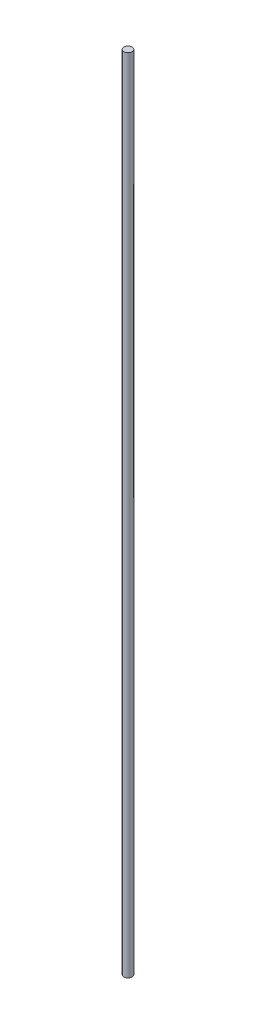
ISO-10303-21;
HEADER;
FILE_DESCRIPTION(('STEP AP214'),'2;1');
FILE_NAME('part.step','',(''),(''),'','','');
FILE_SCHEMA(('AUTOMOTIVE_DESIGN { 1 0 10303 214 1 1 1 1 }'));
ENDSEC;
DATA;
#1=APPLICATION_CONTEXT('core data for automotive mechanical design processes');
#2=APPLICATION_PROTOCOL_DEFINITION('international standard','automotive_design',2000,#1);
#3=PRODUCT_CONTEXT('',#1,'mechanical');
#4=PRODUCT('Part','Part','',(#3));
#5=PRODUCT_RELATED_PRODUCT_CATEGORY('part','',(#4));
#6=PRODUCT_DEFINITION_FORMATION('','',#4);
#7=PRODUCT_DEFINITION_CONTEXT('part definition',#1,'design');
#8=PRODUCT_DEFINITION('design','',#6,#7);
#9=PRODUCT_DEFINITION_SHAPE('','',#8);
#10=(LENGTH_UNIT() NAMED_UNIT(*) SI_UNIT(.MILLI.,.METRE.));
#11=(NAMED_UNIT(*) PLANE_ANGLE_UNIT() SI_UNIT($,.RADIAN.));
#12=(NAMED_UNIT(*) SI_UNIT($,.STERADIAN.) SOLID_ANGLE_UNIT());
#13=UNCERTAINTY_MEASURE_WITH_UNIT(LENGTH_MEASURE(1.E-05),#10,'distance_accuracy_value','');
#14=(GEOMETRIC_REPRESENTATION_CONTEXT(3) GLOBAL_UNCERTAINTY_ASSIGNED_CONTEXT((#13)) GLOBAL_UNIT_ASSIGNED_CONTEXT((#10,
#11,#12)) REPRESENTATION_CONTEXT('',''));
#15=CARTESIAN_POINT('',(0.,0.,0.));
#16=DIRECTION('',(0.,0.,1.));
#17=DIRECTION('',(1.,0.,0.));
#18=AXIS2_PLACEMENT_3D('',#15,#16,#17);
#19=CARTESIAN_POINT('',(0.,617.22,0.));
#20=DIRECTION('',(0.,-1.,0.));
#21=DIRECTION('',(0.,0.,-1.));
#22=AXIS2_PLACEMENT_3D('',#19,#20,#21);
#23=CYLINDRICAL_SURFACE('',#22,3.175);
#24=CARTESIAN_POINT('',(0.,617.22,0.));
#25=DIRECTION('',(0.,1.,0.));
#26=DIRECTION('',(0.,0.,1.));
#27=AXIS2_PLACEMENT_3D('',#24,#25,#26);
#28=CIRCLE('',#27,3.175);
#29=CARTESIAN_POINT('',(0.,617.22,3.175));
#30=VERTEX_POINT('',#29);
#31=EDGE_CURVE('E10',#30,#30,#28,.T.);
#32=ORIENTED_EDGE('',*,*,#31,.F.);
#33=EDGE_LOOP('',(#32));
#34=FACE_BOUND('',#33,.T.);
#35=CARTESIAN_POINT('',(0.,0.,0.));
#36=DIRECTION('',(0.,1.,0.));
#37=DIRECTION('',(0.,0.,1.));
#38=AXIS2_PLACEMENT_3D('',#35,#36,#37);
#39=CIRCLE('',#38,3.175);
#40=CARTESIAN_POINT('',(0.,0.,3.175));
#41=VERTEX_POINT('',#40);
#42=EDGE_CURVE('E34',#41,#41,#39,.T.);
#43=ORIENTED_EDGE('',*,*,#42,.T.);
#44=EDGE_LOOP('',(#43));
#45=FACE_BOUND('',#44,.T.);
#46=ADVANCED_FACE('F31',(#34,#45),#23,.T.);
#47=CARTESIAN_POINT('',(0.,617.22,0.));
#48=DIRECTION('',(0.,1.,0.));
#49=DIRECTION('',(0.,0.,1.));
#50=AXIS2_PLACEMENT_3D('',#47,#48,#49);
#51=PLANE('',#50);
#52=ORIENTED_EDGE('',*,*,#31,.T.);
#53=EDGE_LOOP('',(#52));
#54=FACE_BOUND('',#53,.T.);
#55=ADVANCED_FACE('F46',(#54),#51,.T.);
#56=CARTESIAN_POINT('',(0.,0.,0.));
#57=DIRECTION('',(0.,1.,0.));
#58=DIRECTION('',(0.,0.,1.));
#59=AXIS2_PLACEMENT_3D('',#56,#57,#58);
#60=PLANE('',#59);
#61=ORIENTED_EDGE('',*,*,#42,.F.);
#62=EDGE_LOOP('',(#61));
#63=FACE_BOUND('',#62,.T.);
#64=ADVANCED_FACE('F44',(#63),#60,.F.);
#65=CLOSED_SHELL('',(#46,#55,#64));
#66=MANIFOLD_SOLID_BREP('B2',#65);
#67=ADVANCED_BREP_SHAPE_REPRESENTATION('',(#18,#66),#14);
#68=SHAPE_DEFINITION_REPRESENTATION(#9,#67);
ENDSEC;
END-ISO-10303-21;
